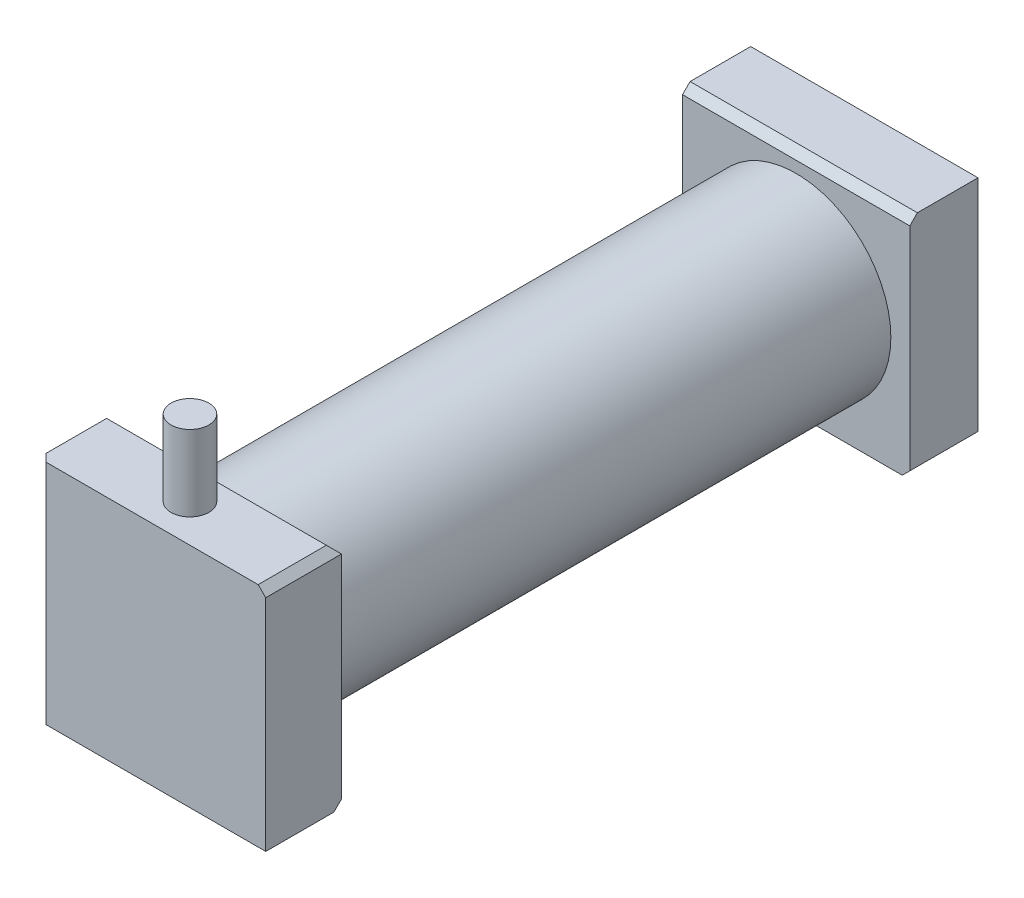
ISO-10303-21;
HEADER;
FILE_DESCRIPTION(('STEP AP214'),'2;1');
FILE_NAME('part.step','',(''),(''),'','','');
FILE_SCHEMA(('AUTOMOTIVE_DESIGN { 1 0 10303 214 1 1 1 1 }'));
ENDSEC;
DATA;
#1=APPLICATION_CONTEXT('core data for automotive mechanical design processes');
#2=APPLICATION_PROTOCOL_DEFINITION('international standard','automotive_design',2000,#1);
#3=PRODUCT_CONTEXT('',#1,'mechanical');
#4=PRODUCT('Part','Part','',(#3));
#5=PRODUCT_RELATED_PRODUCT_CATEGORY('part','',(#4));
#6=PRODUCT_DEFINITION_FORMATION('','',#4);
#7=PRODUCT_DEFINITION_CONTEXT('part definition',#1,'design');
#8=PRODUCT_DEFINITION('design','',#6,#7);
#9=PRODUCT_DEFINITION_SHAPE('','',#8);
#10=(LENGTH_UNIT() NAMED_UNIT(*) SI_UNIT(.MILLI.,.METRE.));
#11=(NAMED_UNIT(*) PLANE_ANGLE_UNIT() SI_UNIT($,.RADIAN.));
#12=(NAMED_UNIT(*) SI_UNIT($,.STERADIAN.) SOLID_ANGLE_UNIT());
#13=UNCERTAINTY_MEASURE_WITH_UNIT(LENGTH_MEASURE(1.E-05),#10,'distance_accuracy_value','');
#14=(GEOMETRIC_REPRESENTATION_CONTEXT(3) GLOBAL_UNCERTAINTY_ASSIGNED_CONTEXT((#13)) GLOBAL_UNIT_ASSIGNED_CONTEXT((#10,
#11,#12)) REPRESENTATION_CONTEXT('',''));
#15=CARTESIAN_POINT('',(0.,0.,0.));
#16=DIRECTION('',(0.,0.,1.));
#17=DIRECTION('',(1.,0.,0.));
#18=AXIS2_PLACEMENT_3D('',#15,#16,#17);
#19=CARTESIAN_POINT('',(0.,0.,150.));
#20=DIRECTION('',(0.,0.,-1.));
#21=DIRECTION('',(-1.,0.,0.));
#22=AXIS2_PLACEMENT_3D('',#19,#20,#21);
#23=CYLINDRICAL_SURFACE('',#22,25.);
#24=CARTESIAN_POINT('',(0.,0.,150.));
#25=DIRECTION('',(0.,0.,1.));
#26=DIRECTION('',(1.,0.,0.));
#27=AXIS2_PLACEMENT_3D('',#24,#25,#26);
#28=CIRCLE('',#27,25.);
#29=CARTESIAN_POINT('',(25.,0.,150.));
#30=VERTEX_POINT('',#29);
#31=EDGE_CURVE('E198',#30,#30,#28,.T.);
#32=ORIENTED_EDGE('',*,*,#31,.F.);
#33=EDGE_LOOP('',(#32));
#34=FACE_BOUND('',#33,.T.);
#35=CARTESIAN_POINT('',(0.,0.,0.));
#36=DIRECTION('',(0.,0.,1.));
#37=DIRECTION('',(1.,0.,0.));
#38=AXIS2_PLACEMENT_3D('',#35,#36,#37);
#39=CIRCLE('',#38,25.);
#40=CARTESIAN_POINT('',(25.,0.,0.));
#41=VERTEX_POINT('',#40);
#42=EDGE_CURVE('E193',#41,#41,#39,.T.);
#43=ORIENTED_EDGE('',*,*,#42,.T.);
#44=EDGE_LOOP('',(#43));
#45=FACE_BOUND('',#44,.T.);
#46=ADVANCED_FACE('F41',(#34,#45),#23,.T.);
#47=CARTESIAN_POINT('',(30.,-30.,-20.));
#48=DIRECTION('',(1.,0.,0.));
#49=DIRECTION('',(0.,0.,-1.));
#50=AXIS2_PLACEMENT_3D('',#47,#48,#49);
#51=PLANE('',#50);
#52=DIRECTION('',(0.,1.,0.));
#53=VECTOR('',#52,1.);
#54=CARTESIAN_POINT('',(30.,-30.,0.));
#55=LINE('',#54,#53);
#56=CARTESIAN_POINT('',(30.,-28.,0.));
#57=VERTEX_POINT('',#56);
#58=CARTESIAN_POINT('',(30.,28.,0.));
#59=VERTEX_POINT('',#58);
#60=EDGE_CURVE('E187',#57,#59,#55,.T.);
#61=ORIENTED_EDGE('',*,*,#60,.F.);
#62=DIRECTION('',(0.,0.,-1.));
#63=VECTOR('',#62,1.);
#64=CARTESIAN_POINT('',(30.,-28.,-20.));
#65=LINE('',#64,#63);
#66=CARTESIAN_POINT('',(30.,-28.,-18.));
#67=VERTEX_POINT('',#66);
#68=EDGE_CURVE('E226',#57,#67,#65,.T.);
#69=ORIENTED_EDGE('',*,*,#68,.T.);
#70=DIRECTION('',(0.,1.,0.));
#71=VECTOR('',#70,1.);
#72=CARTESIAN_POINT('',(30.,-30.,-18.));
#73=LINE('',#72,#71);
#74=CARTESIAN_POINT('',(30.,30.,-18.));
#75=VERTEX_POINT('',#74);
#76=EDGE_CURVE('E228',#67,#75,#73,.T.);
#77=ORIENTED_EDGE('',*,*,#76,.T.);
#78=DIRECTION('',(0.,0.,1.));
#79=VECTOR('',#78,1.);
#80=CARTESIAN_POINT('',(30.,30.,-20.));
#81=LINE('',#80,#79);
#82=CARTESIAN_POINT('',(30.,30.,-1.99999999999997));
#83=VERTEX_POINT('',#82);
#84=EDGE_CURVE('E195',#75,#83,#81,.T.);
#85=ORIENTED_EDGE('',*,*,#84,.T.);
#86=DIRECTION('',(0.,-0.707106781186548,0.707106781186548));
#87=VECTOR('',#86,1.);
#88=CARTESIAN_POINT('',(30.,9.00000000000001,19.));
#89=LINE('',#88,#87);
#90=EDGE_CURVE('E227',#83,#59,#89,.T.);
#91=ORIENTED_EDGE('',*,*,#90,.T.);
#92=EDGE_LOOP('',(#61,#69,#77,#85,#91));
#93=FACE_BOUND('',#92,.T.);
#94=ADVANCED_FACE('F334',(#93),#51,.T.);
#95=CARTESIAN_POINT('',(-30.,-30.,-20.));
#96=DIRECTION('',(0.,-1.,0.));
#97=DIRECTION('',(0.,0.,-1.));
#98=AXIS2_PLACEMENT_3D('',#95,#96,#97);
#99=PLANE('',#98);
#100=CARTESIAN_POINT('',(0.,-30.,-10.));
#101=DIRECTION('',(0.,1.,0.));
#102=DIRECTION('',(0.,0.,1.));
#103=AXIS2_PLACEMENT_3D('',#100,#101,#102);
#104=CIRCLE('',#103,5.);
#105=CARTESIAN_POINT('',(0.,-30.,-5.));
#106=VERTEX_POINT('',#105);
#107=EDGE_CURVE('E243',#106,#106,#104,.T.);
#108=ORIENTED_EDGE('',*,*,#107,.T.);
#109=EDGE_LOOP('',(#108));
#110=FACE_BOUND('',#109,.T.);
#111=DIRECTION('',(1.,0.,0.));
#112=VECTOR('',#111,1.);
#113=CARTESIAN_POINT('',(-30.,-30.,0.));
#114=LINE('',#113,#112);
#115=CARTESIAN_POINT('',(-28.,-30.,0.));
#116=VERTEX_POINT('',#115);
#117=CARTESIAN_POINT('',(28.,-30.,0.));
#118=VERTEX_POINT('',#117);
#119=EDGE_CURVE('E189',#116,#118,#114,.T.);
#120=ORIENTED_EDGE('',*,*,#119,.F.);
#121=DIRECTION('',(0.,0.,-1.));
#122=VECTOR('',#121,1.);
#123=CARTESIAN_POINT('',(-28.,-30.,-20.));
#124=LINE('',#123,#122);
#125=CARTESIAN_POINT('',(-28.,-30.,-20.));
#126=VERTEX_POINT('',#125);
#127=EDGE_CURVE('E217',#116,#126,#124,.T.);
#128=ORIENTED_EDGE('',*,*,#127,.T.);
#129=DIRECTION('',(1.,0.,0.));
#130=VECTOR('',#129,1.);
#131=CARTESIAN_POINT('',(-30.,-30.,-20.));
#132=LINE('',#131,#130);
#133=CARTESIAN_POINT('',(28.,-30.,-20.));
#134=VERTEX_POINT('',#133);
#135=EDGE_CURVE('E302',#126,#134,#132,.T.);
#136=ORIENTED_EDGE('',*,*,#135,.T.);
#137=DIRECTION('',(0.,0.,1.));
#138=VECTOR('',#137,1.);
#139=CARTESIAN_POINT('',(28.,-30.,-20.));
#140=LINE('',#139,#138);
#141=EDGE_CURVE('E214',#134,#118,#140,.T.);
#142=ORIENTED_EDGE('',*,*,#141,.T.);
#143=EDGE_LOOP('',(#120,#128,#136,#142));
#144=FACE_BOUND('',#143,.T.);
#145=ADVANCED_FACE('F339',(#110,#144),#99,.T.);
#146=CARTESIAN_POINT('',(-30.,-30.,-20.));
#147=DIRECTION('',(-1.,0.,0.));
#148=DIRECTION('',(0.,0.,1.));
#149=AXIS2_PLACEMENT_3D('',#146,#147,#148);
#150=PLANE('',#149);
#151=DIRECTION('',(0.,-1.,0.));
#152=VECTOR('',#151,1.);
#153=CARTESIAN_POINT('',(-30.,-30.,-20.));
#154=LINE('',#153,#152);
#155=CARTESIAN_POINT('',(-30.,28.,-20.));
#156=VERTEX_POINT('',#155);
#157=CARTESIAN_POINT('',(-30.,-28.,-20.));
#158=VERTEX_POINT('',#157);
#159=EDGE_CURVE('E291',#156,#158,#154,.T.);
#160=ORIENTED_EDGE('',*,*,#159,.T.);
#161=DIRECTION('',(0.,0.,1.));
#162=VECTOR('',#161,1.);
#163=CARTESIAN_POINT('',(-30.,-28.,-20.));
#164=LINE('',#163,#162);
#165=CARTESIAN_POINT('',(-30.,-28.,0.));
#166=VERTEX_POINT('',#165);
#167=EDGE_CURVE('E202',#158,#166,#164,.T.);
#168=ORIENTED_EDGE('',*,*,#167,.T.);
#169=DIRECTION('',(0.,-1.,0.));
#170=VECTOR('',#169,1.);
#171=CARTESIAN_POINT('',(-30.,-30.,0.));
#172=LINE('',#171,#170);
#173=CARTESIAN_POINT('',(-30.,28.,0.));
#174=VERTEX_POINT('',#173);
#175=EDGE_CURVE('E286',#174,#166,#172,.T.);
#176=ORIENTED_EDGE('',*,*,#175,.F.);
#177=DIRECTION('',(0.,0.707106781186548,-0.707106781186548));
#178=VECTOR('',#177,1.);
#179=CARTESIAN_POINT('',(-30.,9.00000000000001,19.));
#180=LINE('',#179,#178);
#181=CARTESIAN_POINT('',(-30.,30.,-1.99999999999997));
#182=VERTEX_POINT('',#181);
#183=EDGE_CURVE('E203',#174,#182,#180,.T.);
#184=ORIENTED_EDGE('',*,*,#183,.T.);
#185=DIRECTION('',(0.,0.,1.));
#186=VECTOR('',#185,1.);
#187=CARTESIAN_POINT('',(-30.,30.,-20.));
#188=LINE('',#187,#186);
#189=CARTESIAN_POINT('',(-30.,30.,-18.));
#190=VERTEX_POINT('',#189);
#191=EDGE_CURVE('E307',#190,#182,#188,.T.);
#192=ORIENTED_EDGE('',*,*,#191,.F.);
#193=DIRECTION('',(0.,0.707106781186548,0.707106781186548));
#194=VECTOR('',#193,1.);
#195=CARTESIAN_POINT('',(-30.,-0.999999999999987,-49.));
#196=LINE('',#195,#194);
#197=EDGE_CURVE('E201',#190,#156,#196,.F.);
#198=ORIENTED_EDGE('',*,*,#197,.T.);
#199=EDGE_LOOP('',(#160,#168,#176,#184,#192,#198));
#200=FACE_BOUND('',#199,.T.);
#201=ADVANCED_FACE('F491',(#200),#150,.T.);
#202=CARTESIAN_POINT('',(-30.,30.,-20.));
#203=DIRECTION('',(0.,1.,0.));
#204=DIRECTION('',(0.,0.,1.));
#205=AXIS2_PLACEMENT_3D('',#202,#203,#204);
#206=PLANE('',#205);
#207=ORIENTED_EDGE('',*,*,#84,.F.);
#208=DIRECTION('',(-1.,0.,0.));
#209=VECTOR('',#208,1.);
#210=CARTESIAN_POINT('',(-30.,30.,-18.));
#211=LINE('',#210,#209);
#212=EDGE_CURVE('E231',#75,#190,#211,.T.);
#213=ORIENTED_EDGE('',*,*,#212,.T.);
#214=ORIENTED_EDGE('',*,*,#191,.T.);
#215=DIRECTION('',(1.,0.,0.));
#216=VECTOR('',#215,1.);
#217=CARTESIAN_POINT('',(30.,30.,-1.99999999999997));
#218=LINE('',#217,#216);
#219=EDGE_CURVE('E235',#182,#83,#218,.T.);
#220=ORIENTED_EDGE('',*,*,#219,.T.);
#221=EDGE_LOOP('',(#207,#213,#214,#220));
#222=FACE_BOUND('',#221,.T.);
#223=ADVANCED_FACE('F479',(#222),#206,.T.);
#224=CARTESIAN_POINT('',(0.,0.,-20.));
#225=DIRECTION('',(0.,0.,-1.));
#226=DIRECTION('',(-1.,0.,0.));
#227=AXIS2_PLACEMENT_3D('',#224,#225,#226);
#228=PLANE('',#227);
#229=ORIENTED_EDGE('',*,*,#135,.F.);
#230=DIRECTION('',(0.707106781186548,-0.707106781186548,0.));
#231=VECTOR('',#230,1.);
#232=CARTESIAN_POINT('',(-29.,-29.,-20.));
#233=LINE('',#232,#231);
#234=EDGE_CURVE('E221',#126,#158,#233,.F.);
#235=ORIENTED_EDGE('',*,*,#234,.T.);
#236=ORIENTED_EDGE('',*,*,#159,.F.);
#237=DIRECTION('',(1.,0.,0.));
#238=VECTOR('',#237,1.);
#239=CARTESIAN_POINT('',(0.,28.,-20.));
#240=LINE('',#239,#238);
#241=CARTESIAN_POINT('',(28.,28.,-20.));
#242=VERTEX_POINT('',#241);
#243=EDGE_CURVE('E225',#156,#242,#240,.T.);
#244=ORIENTED_EDGE('',*,*,#243,.T.);
#245=DIRECTION('',(0.,-1.,0.));
#246=VECTOR('',#245,1.);
#247=CARTESIAN_POINT('',(28.,0.,-20.));
#248=LINE('',#247,#246);
#249=EDGE_CURVE('E219',#242,#134,#248,.T.);
#250=ORIENTED_EDGE('',*,*,#249,.T.);
#251=EDGE_LOOP('',(#229,#235,#236,#244,#250));
#252=FACE_BOUND('',#251,.T.);
#253=ADVANCED_FACE('F470',(#252),#228,.T.);
#254=CARTESIAN_POINT('',(0.,0.,0.));
#255=DIRECTION('',(0.,0.,-1.));
#256=DIRECTION('',(-1.,0.,0.));
#257=AXIS2_PLACEMENT_3D('',#254,#255,#256);
#258=PLANE('',#257);
#259=ORIENTED_EDGE('',*,*,#42,.F.);
#260=EDGE_LOOP('',(#259));
#261=FACE_BOUND('',#260,.T.);
#262=ORIENTED_EDGE('',*,*,#175,.T.);
#263=DIRECTION('',(-0.707106781186548,0.707106781186548,0.));
#264=VECTOR('',#263,1.);
#265=CARTESIAN_POINT('',(-30.,-28.,0.));
#266=LINE('',#265,#264);
#267=EDGE_CURVE('E213',#166,#116,#266,.F.);
#268=ORIENTED_EDGE('',*,*,#267,.T.);
#269=ORIENTED_EDGE('',*,*,#119,.T.);
#270=DIRECTION('',(-0.707106781186548,-0.707106781186548,0.));
#271=VECTOR('',#270,1.);
#272=CARTESIAN_POINT('',(28.,-30.,0.));
#273=LINE('',#272,#271);
#274=EDGE_CURVE('E211',#118,#57,#273,.F.);
#275=ORIENTED_EDGE('',*,*,#274,.T.);
#276=ORIENTED_EDGE('',*,*,#60,.T.);
#277=DIRECTION('',(-1.,0.,0.));
#278=VECTOR('',#277,1.);
#279=CARTESIAN_POINT('',(-30.,28.,0.));
#280=LINE('',#279,#278);
#281=EDGE_CURVE('E208',#59,#174,#280,.T.);
#282=ORIENTED_EDGE('',*,*,#281,.T.);
#283=EDGE_LOOP('',(#262,#268,#269,#275,#276,#282));
#284=FACE_BOUND('',#283,.T.);
#285=ADVANCED_FACE('F329',(#261,#284),#258,.F.);
#286=CARTESIAN_POINT('',(30.,-30.,170.));
#287=DIRECTION('',(-1.,0.,0.));
#288=DIRECTION('',(0.,0.,1.));
#289=AXIS2_PLACEMENT_3D('',#286,#287,#288);
#290=PLANE('',#289);
#291=DIRECTION('',(0.,1.,0.));
#292=VECTOR('',#291,1.);
#293=CARTESIAN_POINT('',(30.,-30.,150.));
#294=LINE('',#293,#292);
#295=CARTESIAN_POINT('',(30.,-28.,150.));
#296=VERTEX_POINT('',#295);
#297=CARTESIAN_POINT('',(30.,28.,150.));
#298=VERTEX_POINT('',#297);
#299=EDGE_CURVE('E180',#296,#298,#294,.T.);
#300=ORIENTED_EDGE('',*,*,#299,.T.);
#301=DIRECTION('',(0.,0.,1.));
#302=VECTOR('',#301,1.);
#303=CARTESIAN_POINT('',(30.,28.,170.));
#304=LINE('',#303,#302);
#305=CARTESIAN_POINT('',(30.,28.,170.));
#306=VERTEX_POINT('',#305);
#307=EDGE_CURVE('E177',#298,#306,#304,.T.);
#308=ORIENTED_EDGE('',*,*,#307,.T.);
#309=DIRECTION('',(0.,1.,0.));
#310=VECTOR('',#309,1.);
#311=CARTESIAN_POINT('',(30.,-30.,170.));
#312=LINE('',#311,#310);
#313=CARTESIAN_POINT('',(30.,-30.,170.));
#314=VERTEX_POINT('',#313);
#315=EDGE_CURVE('E160',#314,#306,#312,.T.);
#316=ORIENTED_EDGE('',*,*,#315,.F.);
#317=DIRECTION('',(0.,0.,-1.));
#318=VECTOR('',#317,1.);
#319=CARTESIAN_POINT('',(30.,-30.,170.));
#320=LINE('',#319,#318);
#321=CARTESIAN_POINT('',(30.,-30.,152.));
#322=VERTEX_POINT('',#321);
#323=EDGE_CURVE('E165',#314,#322,#320,.T.);
#324=ORIENTED_EDGE('',*,*,#323,.T.);
#325=DIRECTION('',(0.,0.707106781186548,-0.707106781186548));
#326=VECTOR('',#325,1.);
#327=CARTESIAN_POINT('',(30.,-30.,152.));
#328=LINE('',#327,#326);
#329=EDGE_CURVE('E257',#322,#296,#328,.T.);
#330=ORIENTED_EDGE('',*,*,#329,.T.);
#331=EDGE_LOOP('',(#300,#308,#316,#324,#330));
#332=FACE_BOUND('',#331,.T.);
#333=ADVANCED_FACE('F174',(#332),#290,.F.);
#334=CARTESIAN_POINT('',(-30.,30.,170.));
#335=DIRECTION('',(0.,-1.,0.));
#336=DIRECTION('',(0.,0.,-1.));
#337=AXIS2_PLACEMENT_3D('',#334,#335,#336);
#338=PLANE('',#337);
#339=CARTESIAN_POINT('',(0.,30.,160.));
#340=DIRECTION('',(0.,1.,0.));
#341=DIRECTION('',(0.,0.,1.));
#342=AXIS2_PLACEMENT_3D('',#339,#340,#341);
#343=CIRCLE('',#342,5.);
#344=CARTESIAN_POINT('',(0.,30.,165.));
#345=VERTEX_POINT('',#344);
#346=EDGE_CURVE('E185',#345,#345,#343,.T.);
#347=ORIENTED_EDGE('',*,*,#346,.F.);
#348=EDGE_LOOP('',(#347));
#349=FACE_BOUND('',#348,.T.);
#350=DIRECTION('',(0.,0.,-1.));
#351=VECTOR('',#350,1.);
#352=CARTESIAN_POINT('',(-30.,30.,170.));
#353=LINE('',#352,#351);
#354=CARTESIAN_POINT('',(-30.,30.,168.));
#355=VERTEX_POINT('',#354);
#356=CARTESIAN_POINT('',(-30.,30.,152.));
#357=VERTEX_POINT('',#356);
#358=EDGE_CURVE('E304',#355,#357,#353,.T.);
#359=ORIENTED_EDGE('',*,*,#358,.F.);
#360=DIRECTION('',(-0.707106781186548,0.,-0.707106781186548));
#361=VECTOR('',#360,1.);
#362=CARTESIAN_POINT('',(-28.,30.,170.));
#363=LINE('',#362,#361);
#364=CARTESIAN_POINT('',(-28.,30.,170.));
#365=VERTEX_POINT('',#364);
#366=EDGE_CURVE('E256',#355,#365,#363,.F.);
#367=ORIENTED_EDGE('',*,*,#366,.T.);
#368=DIRECTION('',(-1.,0.,0.));
#369=VECTOR('',#368,1.);
#370=CARTESIAN_POINT('',(-30.,30.,170.));
#371=LINE('',#370,#369);
#372=CARTESIAN_POINT('',(28.,30.,170.));
#373=VERTEX_POINT('',#372);
#374=EDGE_CURVE('E284',#373,#365,#371,.T.);
#375=ORIENTED_EDGE('',*,*,#374,.F.);
#376=DIRECTION('',(0.,0.,-1.));
#377=VECTOR('',#376,1.);
#378=CARTESIAN_POINT('',(28.,30.,170.));
#379=LINE('',#378,#377);
#380=CARTESIAN_POINT('',(28.,30.,152.));
#381=VERTEX_POINT('',#380);
#382=EDGE_CURVE('E254',#373,#381,#379,.T.);
#383=ORIENTED_EDGE('',*,*,#382,.T.);
#384=DIRECTION('',(-1.,0.,0.));
#385=VECTOR('',#384,1.);
#386=CARTESIAN_POINT('',(-30.,30.,152.));
#387=LINE('',#386,#385);
#388=EDGE_CURVE('E251',#381,#357,#387,.T.);
#389=ORIENTED_EDGE('',*,*,#388,.T.);
#390=EDGE_LOOP('',(#359,#367,#375,#383,#389));
#391=FACE_BOUND('',#390,.T.);
#392=ADVANCED_FACE('F290',(#349,#391),#338,.F.);
#393=CARTESIAN_POINT('',(-30.,-30.,170.));
#394=DIRECTION('',(1.,0.,0.));
#395=DIRECTION('',(0.,0.,-1.));
#396=AXIS2_PLACEMENT_3D('',#393,#394,#395);
#397=PLANE('',#396);
#398=DIRECTION('',(0.,0.,-1.));
#399=VECTOR('',#398,1.);
#400=CARTESIAN_POINT('',(-30.,-30.,170.));
#401=LINE('',#400,#399);
#402=CARTESIAN_POINT('',(-30.,-30.,168.));
#403=VERTEX_POINT('',#402);
#404=CARTESIAN_POINT('',(-30.,-30.,152.));
#405=VERTEX_POINT('',#404);
#406=EDGE_CURVE('E172',#403,#405,#401,.T.);
#407=ORIENTED_EDGE('',*,*,#406,.F.);
#408=DIRECTION('',(0.,1.,0.));
#409=VECTOR('',#408,1.);
#410=CARTESIAN_POINT('',(-30.,-30.,168.));
#411=LINE('',#410,#409);
#412=EDGE_CURVE('E253',#403,#355,#411,.T.);
#413=ORIENTED_EDGE('',*,*,#412,.T.);
#414=ORIENTED_EDGE('',*,*,#358,.T.);
#415=DIRECTION('',(0.,-1.,0.));
#416=VECTOR('',#415,1.);
#417=CARTESIAN_POINT('',(-30.,-30.,152.));
#418=LINE('',#417,#416);
#419=EDGE_CURVE('E246',#357,#405,#418,.T.);
#420=ORIENTED_EDGE('',*,*,#419,.T.);
#421=EDGE_LOOP('',(#407,#413,#414,#420));
#422=FACE_BOUND('',#421,.T.);
#423=ADVANCED_FACE('F325',(#422),#397,.F.);
#424=CARTESIAN_POINT('',(-30.,-30.,170.));
#425=DIRECTION('',(0.,1.,0.));
#426=DIRECTION('',(0.,0.,1.));
#427=AXIS2_PLACEMENT_3D('',#424,#425,#426);
#428=PLANE('',#427);
#429=DIRECTION('',(1.,0.,0.));
#430=VECTOR('',#429,1.);
#431=CARTESIAN_POINT('',(-30.,-30.,170.));
#432=LINE('',#431,#430);
#433=CARTESIAN_POINT('',(-28.,-30.,170.));
#434=VERTEX_POINT('',#433);
#435=EDGE_CURVE('E155',#434,#314,#432,.T.);
#436=ORIENTED_EDGE('',*,*,#435,.F.);
#437=DIRECTION('',(0.707106781186548,0.,0.707106781186548));
#438=VECTOR('',#437,1.);
#439=CARTESIAN_POINT('',(-28.,-30.,170.));
#440=LINE('',#439,#438);
#441=EDGE_CURVE('E250',#434,#403,#440,.F.);
#442=ORIENTED_EDGE('',*,*,#441,.T.);
#443=ORIENTED_EDGE('',*,*,#406,.T.);
#444=DIRECTION('',(1.,0.,0.));
#445=VECTOR('',#444,1.);
#446=CARTESIAN_POINT('',(30.,-30.,152.));
#447=LINE('',#446,#445);
#448=EDGE_CURVE('E169',#405,#322,#447,.T.);
#449=ORIENTED_EDGE('',*,*,#448,.T.);
#450=ORIENTED_EDGE('',*,*,#323,.F.);
#451=EDGE_LOOP('',(#436,#442,#443,#449,#450));
#452=FACE_BOUND('',#451,.T.);
#453=ADVANCED_FACE('F164',(#452),#428,.F.);
#454=CARTESIAN_POINT('',(0.,0.,170.));
#455=DIRECTION('',(0.,0.,-1.));
#456=DIRECTION('',(-1.,0.,0.));
#457=AXIS2_PLACEMENT_3D('',#454,#455,#456);
#458=PLANE('',#457);
#459=ORIENTED_EDGE('',*,*,#374,.T.);
#460=DIRECTION('',(0.,-1.,0.));
#461=VECTOR('',#460,1.);
#462=CARTESIAN_POINT('',(-28.,0.,170.));
#463=LINE('',#462,#461);
#464=EDGE_CURVE('E159',#365,#434,#463,.T.);
#465=ORIENTED_EDGE('',*,*,#464,.T.);
#466=ORIENTED_EDGE('',*,*,#435,.T.);
#467=ORIENTED_EDGE('',*,*,#315,.T.);
#468=DIRECTION('',(0.707106781186548,-0.707106781186548,0.));
#469=VECTOR('',#468,1.);
#470=CARTESIAN_POINT('',(28.,30.,170.));
#471=LINE('',#470,#469);
#472=EDGE_CURVE('E237',#306,#373,#471,.F.);
#473=ORIENTED_EDGE('',*,*,#472,.T.);
#474=EDGE_LOOP('',(#459,#465,#466,#467,#473));
#475=FACE_BOUND('',#474,.T.);
#476=ADVANCED_FACE('F154',(#475),#458,.F.);
#477=CARTESIAN_POINT('',(0.,0.,150.));
#478=DIRECTION('',(0.,0.,-1.));
#479=DIRECTION('',(-1.,0.,0.));
#480=AXIS2_PLACEMENT_3D('',#477,#478,#479);
#481=PLANE('',#480);
#482=ORIENTED_EDGE('',*,*,#31,.T.);
#483=EDGE_LOOP('',(#482));
#484=FACE_BOUND('',#483,.T.);
#485=ORIENTED_EDGE('',*,*,#299,.F.);
#486=DIRECTION('',(-1.,0.,0.));
#487=VECTOR('',#486,1.);
#488=CARTESIAN_POINT('',(-30.,-28.,150.));
#489=LINE('',#488,#487);
#490=CARTESIAN_POINT('',(-28.,-28.,150.));
#491=VERTEX_POINT('',#490);
#492=EDGE_CURVE('E11',#296,#491,#489,.T.);
#493=ORIENTED_EDGE('',*,*,#492,.T.);
#494=DIRECTION('',(0.,1.,0.));
#495=VECTOR('',#494,1.);
#496=CARTESIAN_POINT('',(-28.,30.,150.));
#497=LINE('',#496,#495);
#498=CARTESIAN_POINT('',(-28.,28.,150.));
#499=VERTEX_POINT('',#498);
#500=EDGE_CURVE('E51',#491,#499,#497,.T.);
#501=ORIENTED_EDGE('',*,*,#500,.T.);
#502=DIRECTION('',(1.,0.,0.));
#503=VECTOR('',#502,1.);
#504=CARTESIAN_POINT('',(30.,28.,150.));
#505=LINE('',#504,#503);
#506=EDGE_CURVE('E263',#499,#298,#505,.T.);
#507=ORIENTED_EDGE('',*,*,#506,.T.);
#508=EDGE_LOOP('',(#485,#493,#501,#507));
#509=FACE_BOUND('',#508,.T.);
#510=ADVANCED_FACE('F280',(#484,#509),#481,.T.);
#511=CARTESIAN_POINT('',(0.,50.,160.));
#512=DIRECTION('',(0.,-1.,0.));
#513=DIRECTION('',(0.,0.,-1.));
#514=AXIS2_PLACEMENT_3D('',#511,#512,#513);
#515=CYLINDRICAL_SURFACE('',#514,5.);
#516=CARTESIAN_POINT('',(0.,50.,160.));
#517=DIRECTION('',(0.,1.,0.));
#518=DIRECTION('',(0.,0.,1.));
#519=AXIS2_PLACEMENT_3D('',#516,#517,#518);
#520=CIRCLE('',#519,5.);
#521=CARTESIAN_POINT('',(0.,50.,165.));
#522=VERTEX_POINT('',#521);
#523=EDGE_CURVE('E176',#522,#522,#520,.T.);
#524=ORIENTED_EDGE('',*,*,#523,.F.);
#525=EDGE_LOOP('',(#524));
#526=FACE_BOUND('',#525,.T.);
#527=ORIENTED_EDGE('',*,*,#346,.T.);
#528=EDGE_LOOP('',(#527));
#529=FACE_BOUND('',#528,.T.);
#530=ADVANCED_FACE('F314',(#526,#529),#515,.T.);
#531=CARTESIAN_POINT('',(0.,50.,160.));
#532=DIRECTION('',(0.,1.,0.));
#533=DIRECTION('',(0.,0.,1.));
#534=AXIS2_PLACEMENT_3D('',#531,#532,#533);
#535=PLANE('',#534);
#536=ORIENTED_EDGE('',*,*,#523,.T.);
#537=EDGE_LOOP('',(#536));
#538=FACE_BOUND('',#537,.T.);
#539=ADVANCED_FACE('F315',(#538),#535,.T.);
#540=CARTESIAN_POINT('',(0.,-10.,-10.));
#541=DIRECTION('',(0.,-1.,0.));
#542=DIRECTION('',(0.,0.,-1.));
#543=AXIS2_PLACEMENT_3D('',#540,#541,#542);
#544=CYLINDRICAL_SURFACE('',#543,5.);
#545=CARTESIAN_POINT('',(0.,-10.,-10.));
#546=DIRECTION('',(0.,1.,0.));
#547=DIRECTION('',(0.,0.,1.));
#548=AXIS2_PLACEMENT_3D('',#545,#546,#547);
#549=CIRCLE('',#548,5.);
#550=CARTESIAN_POINT('',(0.,-10.,-5.));
#551=VERTEX_POINT('',#550);
#552=EDGE_CURVE('E288',#551,#551,#549,.T.);
#553=ORIENTED_EDGE('',*,*,#552,.T.);
#554=EDGE_LOOP('',(#553));
#555=FACE_BOUND('',#554,.T.);
#556=ORIENTED_EDGE('',*,*,#107,.F.);
#557=EDGE_LOOP('',(#556));
#558=FACE_BOUND('',#557,.T.);
#559=ADVANCED_FACE('F598',(#555,#558),#544,.F.);
#560=CARTESIAN_POINT('',(0.,-10.,-10.));
#561=DIRECTION('',(0.,1.,0.));
#562=DIRECTION('',(0.,0.,1.));
#563=AXIS2_PLACEMENT_3D('',#560,#561,#562);
#564=PLANE('',#563);
#565=ORIENTED_EDGE('',*,*,#552,.F.);
#566=EDGE_LOOP('',(#565));
#567=FACE_BOUND('',#566,.T.);
#568=ADVANCED_FACE('F354',(#567),#564,.F.);
#569=CARTESIAN_POINT('',(-30.,-28.,-20.));
#570=DIRECTION('',(0.707106781186547,0.707106781186547,0.));
#571=DIRECTION('',(0.,0.,1.));
#572=AXIS2_PLACEMENT_3D('',#569,#570,#571);
#573=PLANE('',#572);
#574=ORIENTED_EDGE('',*,*,#234,.F.);
#575=ORIENTED_EDGE('',*,*,#127,.F.);
#576=ORIENTED_EDGE('',*,*,#267,.F.);
#577=ORIENTED_EDGE('',*,*,#167,.F.);
#578=EDGE_LOOP('',(#574,#575,#576,#577));
#579=FACE_BOUND('',#578,.T.);
#580=ADVANCED_FACE('F350',(#579),#573,.F.);
#581=CARTESIAN_POINT('',(-30.,30.,-18.));
#582=DIRECTION('',(0.,-0.707106781186547,0.707106781186547));
#583=DIRECTION('',(-1.,0.,0.));
#584=AXIS2_PLACEMENT_3D('',#581,#582,#583);
#585=PLANE('',#584);
#586=ORIENTED_EDGE('',*,*,#197,.F.);
#587=ORIENTED_EDGE('',*,*,#212,.F.);
#588=DIRECTION('',(0.577350269189626,0.577350269189626,0.577350269189626));
#589=VECTOR('',#588,1.);
#590=CARTESIAN_POINT('',(10.,10.,-38.));
#591=LINE('',#590,#589);
#592=EDGE_CURVE('E238',#242,#75,#591,.T.);
#593=ORIENTED_EDGE('',*,*,#592,.F.);
#594=ORIENTED_EDGE('',*,*,#243,.F.);
#595=EDGE_LOOP('',(#586,#587,#593,#594));
#596=FACE_BOUND('',#595,.T.);
#597=ADVANCED_FACE('F353',(#596),#585,.F.);
#598=CARTESIAN_POINT('',(30.,-30.,-18.));
#599=DIRECTION('',(-0.707106781186547,0.,0.707106781186547));
#600=DIRECTION('',(0.,1.,0.));
#601=AXIS2_PLACEMENT_3D('',#598,#599,#600);
#602=PLANE('',#601);
#603=ORIENTED_EDGE('',*,*,#592,.T.);
#604=ORIENTED_EDGE('',*,*,#76,.F.);
#605=DIRECTION('',(-0.577350269189626,-0.577350269189626,-0.577350269189626));
#606=VECTOR('',#605,1.);
#607=CARTESIAN_POINT('',(29.3333333333333,-28.6666666666667,-18.6666666666667));
#608=LINE('',#607,#606);
#609=EDGE_CURVE('E240',#134,#67,#608,.F.);
#610=ORIENTED_EDGE('',*,*,#609,.F.);
#611=ORIENTED_EDGE('',*,*,#249,.F.);
#612=EDGE_LOOP('',(#603,#604,#610,#611));
#613=FACE_BOUND('',#612,.T.);
#614=ADVANCED_FACE('F364',(#613),#602,.F.);
#615=CARTESIAN_POINT('',(28.,-30.,-20.));
#616=DIRECTION('',(-0.707106781186547,0.707106781186547,0.));
#617=DIRECTION('',(0.,0.,1.));
#618=AXIS2_PLACEMENT_3D('',#615,#616,#617);
#619=PLANE('',#618);
#620=ORIENTED_EDGE('',*,*,#609,.T.);
#621=ORIENTED_EDGE('',*,*,#68,.F.);
#622=ORIENTED_EDGE('',*,*,#274,.F.);
#623=ORIENTED_EDGE('',*,*,#141,.F.);
#624=EDGE_LOOP('',(#620,#621,#622,#623));
#625=FACE_BOUND('',#624,.T.);
#626=ADVANCED_FACE('F360',(#625),#619,.F.);
#627=CARTESIAN_POINT('',(0.,28.,0.));
#628=DIRECTION('',(0.,0.707106781186547,0.707106781186547));
#629=DIRECTION('',(1.,0.,0.));
#630=AXIS2_PLACEMENT_3D('',#627,#628,#629);
#631=PLANE('',#630);
#632=ORIENTED_EDGE('',*,*,#90,.F.);
#633=ORIENTED_EDGE('',*,*,#219,.F.);
#634=ORIENTED_EDGE('',*,*,#183,.F.);
#635=ORIENTED_EDGE('',*,*,#281,.F.);
#636=EDGE_LOOP('',(#632,#633,#634,#635));
#637=FACE_BOUND('',#636,.T.);
#638=ADVANCED_FACE('F365',(#637),#631,.T.);
#639=CARTESIAN_POINT('',(-28.,0.,170.));
#640=DIRECTION('',(0.707106781186547,0.,-0.707106781186547));
#641=DIRECTION('',(0.,-1.,0.));
#642=AXIS2_PLACEMENT_3D('',#639,#640,#641);
#643=PLANE('',#642);
#644=ORIENTED_EDGE('',*,*,#366,.F.);
#645=ORIENTED_EDGE('',*,*,#412,.F.);
#646=ORIENTED_EDGE('',*,*,#441,.F.);
#647=ORIENTED_EDGE('',*,*,#464,.F.);
#648=EDGE_LOOP('',(#644,#645,#646,#647));
#649=FACE_BOUND('',#648,.T.);
#650=ADVANCED_FACE('F385',(#649),#643,.F.);
#651=CARTESIAN_POINT('',(-30.,-30.,152.));
#652=DIRECTION('',(0.,-0.707106781186547,-0.707106781186547));
#653=DIRECTION('',(-1.,0.,0.));
#654=AXIS2_PLACEMENT_3D('',#651,#652,#653);
#655=PLANE('',#654);
#656=ORIENTED_EDGE('',*,*,#329,.F.);
#657=ORIENTED_EDGE('',*,*,#448,.F.);
#658=DIRECTION('',(-0.577350269189626,-0.577350269189626,0.577350269189626));
#659=VECTOR('',#658,1.);
#660=CARTESIAN_POINT('',(-30.,-30.,152.));
#661=LINE('',#660,#659);
#662=EDGE_CURVE('E46',#491,#405,#661,.T.);
#663=ORIENTED_EDGE('',*,*,#662,.F.);
#664=ORIENTED_EDGE('',*,*,#492,.F.);
#665=EDGE_LOOP('',(#656,#657,#663,#664));
#666=FACE_BOUND('',#665,.T.);
#667=ADVANCED_FACE('F42',(#666),#655,.T.);
#668=CARTESIAN_POINT('',(-30.,-30.,152.));
#669=DIRECTION('',(-0.707106781186547,0.,-0.707106781186547));
#670=DIRECTION('',(0.,1.,0.));
#671=AXIS2_PLACEMENT_3D('',#668,#669,#670);
#672=PLANE('',#671);
#673=ORIENTED_EDGE('',*,*,#662,.T.);
#674=ORIENTED_EDGE('',*,*,#419,.F.);
#675=DIRECTION('',(-0.577350269189626,0.577350269189626,0.577350269189626));
#676=VECTOR('',#675,1.);
#677=CARTESIAN_POINT('',(-30.,30.,152.));
#678=LINE('',#677,#676);
#679=EDGE_CURVE('E270',#499,#357,#678,.T.);
#680=ORIENTED_EDGE('',*,*,#679,.F.);
#681=ORIENTED_EDGE('',*,*,#500,.F.);
#682=EDGE_LOOP('',(#673,#674,#680,#681));
#683=FACE_BOUND('',#682,.T.);
#684=ADVANCED_FACE('F274',(#683),#672,.T.);
#685=CARTESIAN_POINT('',(-30.,30.,152.));
#686=DIRECTION('',(0.,0.707106781186547,-0.707106781186547));
#687=DIRECTION('',(1.,0.,0.));
#688=AXIS2_PLACEMENT_3D('',#685,#686,#687);
#689=PLANE('',#688);
#690=ORIENTED_EDGE('',*,*,#679,.T.);
#691=ORIENTED_EDGE('',*,*,#388,.F.);
#692=DIRECTION('',(-0.577350269189626,0.577350269189626,0.577350269189626));
#693=VECTOR('',#692,1.);
#694=CARTESIAN_POINT('',(8.66666666666667,49.3333333333333,171.333333333333));
#695=LINE('',#694,#693);
#696=EDGE_CURVE('E266',#298,#381,#695,.T.);
#697=ORIENTED_EDGE('',*,*,#696,.F.);
#698=ORIENTED_EDGE('',*,*,#506,.F.);
#699=EDGE_LOOP('',(#690,#691,#697,#698));
#700=FACE_BOUND('',#699,.T.);
#701=ADVANCED_FACE('F276',(#700),#689,.T.);
#702=CARTESIAN_POINT('',(28.,30.,170.));
#703=DIRECTION('',(-0.707106781186547,-0.707106781186547,0.));
#704=DIRECTION('',(0.,0.,-1.));
#705=AXIS2_PLACEMENT_3D('',#702,#703,#704);
#706=PLANE('',#705);
#707=ORIENTED_EDGE('',*,*,#472,.F.);
#708=ORIENTED_EDGE('',*,*,#307,.F.);
#709=ORIENTED_EDGE('',*,*,#696,.T.);
#710=ORIENTED_EDGE('',*,*,#382,.F.);
#711=EDGE_LOOP('',(#707,#708,#709,#710));
#712=FACE_BOUND('',#711,.T.);
#713=ADVANCED_FACE('F285',(#712),#706,.F.);
#714=CLOSED_SHELL('',(#46,#94,#145,#201,#223,#253,#285,#333,#392,#423,#453,#476,#510,#530,#539,
#559,#568,#580,#597,#614,#626,#638,#650,#667,#684,#701,#713));
#715=MANIFOLD_SOLID_BREP('B2',#714);
#716=ADVANCED_BREP_SHAPE_REPRESENTATION('',(#18,#715),#14);
#717=SHAPE_DEFINITION_REPRESENTATION(#9,#716);
ENDSEC;
END-ISO-10303-21;
